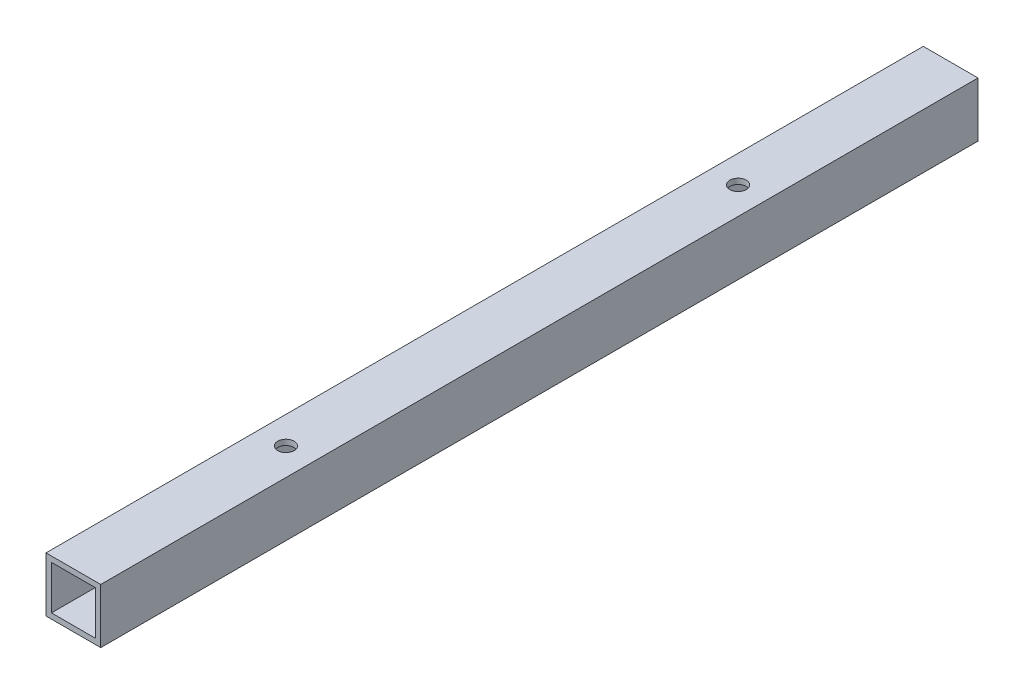
ISO-10303-21;
HEADER;
FILE_DESCRIPTION(('STEP AP214'),'2;1');
FILE_NAME('part.step','',(''),(''),'','','');
FILE_SCHEMA(('AUTOMOTIVE_DESIGN { 1 0 10303 214 1 1 1 1 }'));
ENDSEC;
DATA;
#1=APPLICATION_CONTEXT('core data for automotive mechanical design processes');
#2=APPLICATION_PROTOCOL_DEFINITION('international standard','automotive_design',2000,#1);
#3=PRODUCT_CONTEXT('',#1,'mechanical');
#4=PRODUCT('Part','Part','',(#3));
#5=PRODUCT_RELATED_PRODUCT_CATEGORY('part','',(#4));
#6=PRODUCT_DEFINITION_FORMATION('','',#4);
#7=PRODUCT_DEFINITION_CONTEXT('part definition',#1,'design');
#8=PRODUCT_DEFINITION('design','',#6,#7);
#9=PRODUCT_DEFINITION_SHAPE('','',#8);
#10=(LENGTH_UNIT() NAMED_UNIT(*) SI_UNIT(.MILLI.,.METRE.));
#11=(NAMED_UNIT(*) PLANE_ANGLE_UNIT() SI_UNIT($,.RADIAN.));
#12=(NAMED_UNIT(*) SI_UNIT($,.STERADIAN.) SOLID_ANGLE_UNIT());
#13=UNCERTAINTY_MEASURE_WITH_UNIT(LENGTH_MEASURE(1.E-05),#10,'distance_accuracy_value','');
#14=(GEOMETRIC_REPRESENTATION_CONTEXT(3) GLOBAL_UNCERTAINTY_ASSIGNED_CONTEXT((#13)) GLOBAL_UNIT_ASSIGNED_CONTEXT((#10,
#11,#12)) REPRESENTATION_CONTEXT('',''));
#15=CARTESIAN_POINT('',(0.,0.,0.));
#16=DIRECTION('',(0.,0.,1.));
#17=DIRECTION('',(1.,0.,0.));
#18=AXIS2_PLACEMENT_3D('',#15,#16,#17);
#19=CARTESIAN_POINT('',(0.,0.,80.155));
#20=DIRECTION('',(0.,0.,-1.));
#21=DIRECTION('',(-1.,0.,0.));
#22=AXIS2_PLACEMENT_3D('',#19,#20,#21);
#23=PLANE('',#22);
#24=DIRECTION('',(0.,-1.,0.));
#25=VECTOR('',#24,1.);
#26=CARTESIAN_POINT('',(-5.,5.,80.155));
#27=LINE('',#26,#25);
#28=CARTESIAN_POINT('',(-5.,5.,80.155));
#29=VERTEX_POINT('',#28);
#30=CARTESIAN_POINT('',(-5.,-5.,80.155));
#31=VERTEX_POINT('',#30);
#32=EDGE_CURVE('E140',#29,#31,#27,.T.);
#33=ORIENTED_EDGE('',*,*,#32,.T.);
#34=DIRECTION('',(1.,0.,0.));
#35=VECTOR('',#34,1.);
#36=CARTESIAN_POINT('',(5.,-5.,80.155));
#37=LINE('',#36,#35);
#38=CARTESIAN_POINT('',(5.,-5.,80.155));
#39=VERTEX_POINT('',#38);
#40=EDGE_CURVE('E143',#31,#39,#37,.T.);
#41=ORIENTED_EDGE('',*,*,#40,.T.);
#42=DIRECTION('',(0.,1.,0.));
#43=VECTOR('',#42,1.);
#44=CARTESIAN_POINT('',(5.,5.,80.155));
#45=LINE('',#44,#43);
#46=CARTESIAN_POINT('',(5.,5.,80.155));
#47=VERTEX_POINT('',#46);
#48=EDGE_CURVE('E146',#39,#47,#45,.T.);
#49=ORIENTED_EDGE('',*,*,#48,.T.);
#50=DIRECTION('',(-1.,0.,0.));
#51=VECTOR('',#50,1.);
#52=CARTESIAN_POINT('',(5.,5.,80.155));
#53=LINE('',#52,#51);
#54=EDGE_CURVE('E148',#47,#29,#53,.T.);
#55=ORIENTED_EDGE('',*,*,#54,.T.);
#56=EDGE_LOOP('',(#33,#41,#49,#55));
#57=FACE_BOUND('',#56,.T.);
#58=DIRECTION('',(0.,-1.,0.));
#59=VECTOR('',#58,1.);
#60=CARTESIAN_POINT('',(-4.,4.,80.155));
#61=LINE('',#60,#59);
#62=CARTESIAN_POINT('',(-4.,4.,80.155));
#63=VERTEX_POINT('',#62);
#64=CARTESIAN_POINT('',(-4.,-4.,80.155));
#65=VERTEX_POINT('',#64);
#66=EDGE_CURVE('E102',#63,#65,#61,.T.);
#67=ORIENTED_EDGE('',*,*,#66,.F.);
#68=DIRECTION('',(-1.,0.,0.));
#69=VECTOR('',#68,1.);
#70=CARTESIAN_POINT('',(3.99999999999999,4.,80.155));
#71=LINE('',#70,#69);
#72=CARTESIAN_POINT('',(3.99999999999999,4.,80.155));
#73=VERTEX_POINT('',#72);
#74=EDGE_CURVE('E124',#73,#63,#71,.T.);
#75=ORIENTED_EDGE('',*,*,#74,.F.);
#76=DIRECTION('',(0.,1.,0.));
#77=VECTOR('',#76,1.);
#78=CARTESIAN_POINT('',(3.99999999999999,4.,80.155));
#79=LINE('',#78,#77);
#80=CARTESIAN_POINT('',(3.99999999999999,-4.,80.155));
#81=VERTEX_POINT('',#80);
#82=EDGE_CURVE('E122',#81,#73,#79,.T.);
#83=ORIENTED_EDGE('',*,*,#82,.F.);
#84=DIRECTION('',(1.,0.,0.));
#85=VECTOR('',#84,1.);
#86=CARTESIAN_POINT('',(3.99999999999999,-4.,80.155));
#87=LINE('',#86,#85);
#88=EDGE_CURVE('E110',#65,#81,#87,.T.);
#89=ORIENTED_EDGE('',*,*,#88,.F.);
#90=EDGE_LOOP('',(#67,#75,#83,#89));
#91=FACE_BOUND('',#90,.T.);
#92=ADVANCED_FACE('F35',(#57,#91),#23,.F.);
#93=CARTESIAN_POINT('',(0.,0.,-80.155));
#94=DIRECTION('',(0.,0.,-1.));
#95=DIRECTION('',(-1.,0.,0.));
#96=AXIS2_PLACEMENT_3D('',#93,#94,#95);
#97=PLANE('',#96);
#98=DIRECTION('',(0.,-1.,0.));
#99=VECTOR('',#98,1.);
#100=CARTESIAN_POINT('',(-5.,5.,-80.155));
#101=LINE('',#100,#99);
#102=CARTESIAN_POINT('',(-5.,5.,-80.155));
#103=VERTEX_POINT('',#102);
#104=CARTESIAN_POINT('',(-5.,-5.,-80.155));
#105=VERTEX_POINT('',#104);
#106=EDGE_CURVE('E118',#103,#105,#101,.T.);
#107=ORIENTED_EDGE('',*,*,#106,.F.);
#108=DIRECTION('',(-1.,0.,0.));
#109=VECTOR('',#108,1.);
#110=CARTESIAN_POINT('',(5.,5.,-80.155));
#111=LINE('',#110,#109);
#112=CARTESIAN_POINT('',(5.,5.,-80.155));
#113=VERTEX_POINT('',#112);
#114=EDGE_CURVE('E144',#113,#103,#111,.T.);
#115=ORIENTED_EDGE('',*,*,#114,.F.);
#116=DIRECTION('',(0.,1.,0.));
#117=VECTOR('',#116,1.);
#118=CARTESIAN_POINT('',(5.,5.,-80.155));
#119=LINE('',#118,#117);
#120=CARTESIAN_POINT('',(5.,-5.,-80.155));
#121=VERTEX_POINT('',#120);
#122=EDGE_CURVE('E155',#121,#113,#119,.T.);
#123=ORIENTED_EDGE('',*,*,#122,.F.);
#124=DIRECTION('',(1.,0.,0.));
#125=VECTOR('',#124,1.);
#126=CARTESIAN_POINT('',(5.,-5.,-80.155));
#127=LINE('',#126,#125);
#128=EDGE_CURVE('E153',#105,#121,#127,.T.);
#129=ORIENTED_EDGE('',*,*,#128,.F.);
#130=EDGE_LOOP('',(#107,#115,#123,#129));
#131=FACE_BOUND('',#130,.T.);
#132=DIRECTION('',(-1.,0.,0.));
#133=VECTOR('',#132,1.);
#134=CARTESIAN_POINT('',(3.99999999999999,4.,-80.155));
#135=LINE('',#134,#133);
#136=CARTESIAN_POINT('',(3.99999999999999,4.,-80.155));
#137=VERTEX_POINT('',#136);
#138=CARTESIAN_POINT('',(-4.,4.,-80.155));
#139=VERTEX_POINT('',#138);
#140=EDGE_CURVE('E111',#137,#139,#135,.T.);
#141=ORIENTED_EDGE('',*,*,#140,.T.);
#142=DIRECTION('',(0.,-1.,0.));
#143=VECTOR('',#142,1.);
#144=CARTESIAN_POINT('',(-4.,4.,-80.155));
#145=LINE('',#144,#143);
#146=CARTESIAN_POINT('',(-4.,-4.,-80.155));
#147=VERTEX_POINT('',#146);
#148=EDGE_CURVE('E60',#139,#147,#145,.T.);
#149=ORIENTED_EDGE('',*,*,#148,.T.);
#150=DIRECTION('',(1.,0.,0.));
#151=VECTOR('',#150,1.);
#152=CARTESIAN_POINT('',(3.99999999999999,-4.,-80.155));
#153=LINE('',#152,#151);
#154=CARTESIAN_POINT('',(3.99999999999999,-4.,-80.155));
#155=VERTEX_POINT('',#154);
#156=EDGE_CURVE('E117',#147,#155,#153,.T.);
#157=ORIENTED_EDGE('',*,*,#156,.T.);
#158=DIRECTION('',(0.,1.,0.));
#159=VECTOR('',#158,1.);
#160=CARTESIAN_POINT('',(3.99999999999999,4.,-80.155));
#161=LINE('',#160,#159);
#162=EDGE_CURVE('E132',#155,#137,#161,.T.);
#163=ORIENTED_EDGE('',*,*,#162,.T.);
#164=EDGE_LOOP('',(#141,#149,#157,#163));
#165=FACE_BOUND('',#164,.T.);
#166=ADVANCED_FACE('F205',(#131,#165),#97,.T.);
#167=CARTESIAN_POINT('',(-5.,5.,80.155));
#168=DIRECTION('',(1.,0.,0.));
#169=DIRECTION('',(0.,0.,-1.));
#170=AXIS2_PLACEMENT_3D('',#167,#168,#169);
#171=PLANE('',#170);
#172=ORIENTED_EDGE('',*,*,#106,.T.);
#173=DIRECTION('',(0.,0.,-1.));
#174=VECTOR('',#173,1.);
#175=CARTESIAN_POINT('',(-5.,-5.,80.155));
#176=LINE('',#175,#174);
#177=EDGE_CURVE('E11',#31,#105,#176,.T.);
#178=ORIENTED_EDGE('',*,*,#177,.F.);
#179=ORIENTED_EDGE('',*,*,#32,.F.);
#180=DIRECTION('',(0.,0.,-1.));
#181=VECTOR('',#180,1.);
#182=CARTESIAN_POINT('',(-5.,5.,80.155));
#183=LINE('',#182,#181);
#184=EDGE_CURVE('E150',#29,#103,#183,.T.);
#185=ORIENTED_EDGE('',*,*,#184,.T.);
#186=EDGE_LOOP('',(#172,#178,#179,#185));
#187=FACE_BOUND('',#186,.T.);
#188=ADVANCED_FACE('F37',(#187),#171,.F.);
#189=CARTESIAN_POINT('',(5.,-5.,80.155));
#190=DIRECTION('',(0.,1.,0.));
#191=DIRECTION('',(-1.,0.,0.));
#192=AXIS2_PLACEMENT_3D('',#189,#190,#191);
#193=PLANE('',#192);
#194=CARTESIAN_POINT('',(-0.00347552228163782,-5.,41.3127409831395));
#195=DIRECTION('',(0.,-1.,0.));
#196=DIRECTION('',(0.,0.,-1.));
#197=AXIS2_PLACEMENT_3D('',#194,#195,#196);
#198=CIRCLE('',#197,1.50000000000001);
#199=CARTESIAN_POINT('',(-0.00347552228163782,-5.,39.8127409831395));
#200=VERTEX_POINT('',#199);
#201=EDGE_CURVE('E184',#200,#200,#198,.T.);
#202=ORIENTED_EDGE('',*,*,#201,.F.);
#203=EDGE_LOOP('',(#202));
#204=FACE_BOUND('',#203,.T.);
#205=CARTESIAN_POINT('',(-0.00347552228167946,-5.,-41.3127409831751));
#206=DIRECTION('',(0.,-1.,0.));
#207=DIRECTION('',(0.,0.,-1.));
#208=AXIS2_PLACEMENT_3D('',#205,#206,#207);
#209=CIRCLE('',#208,1.50000000000001);
#210=CARTESIAN_POINT('',(-0.00347552228167946,-5.,-42.8127409831752));
#211=VERTEX_POINT('',#210);
#212=EDGE_CURVE('E171',#211,#211,#209,.T.);
#213=ORIENTED_EDGE('',*,*,#212,.F.);
#214=EDGE_LOOP('',(#213));
#215=FACE_BOUND('',#214,.T.);
#216=ORIENTED_EDGE('',*,*,#128,.T.);
#217=DIRECTION('',(0.,0.,-1.));
#218=VECTOR('',#217,1.);
#219=CARTESIAN_POINT('',(5.,-5.,80.155));
#220=LINE('',#219,#218);
#221=EDGE_CURVE('E44',#39,#121,#220,.T.);
#222=ORIENTED_EDGE('',*,*,#221,.F.);
#223=ORIENTED_EDGE('',*,*,#40,.F.);
#224=ORIENTED_EDGE('',*,*,#177,.T.);
#225=EDGE_LOOP('',(#216,#222,#223,#224));
#226=FACE_BOUND('',#225,.T.);
#227=ADVANCED_FACE('F190',(#204,#215,#226),#193,.F.);
#228=CARTESIAN_POINT('',(5.,5.,80.155));
#229=DIRECTION('',(-1.,0.,0.));
#230=DIRECTION('',(0.,0.,1.));
#231=AXIS2_PLACEMENT_3D('',#228,#229,#230);
#232=PLANE('',#231);
#233=ORIENTED_EDGE('',*,*,#122,.T.);
#234=DIRECTION('',(0.,0.,-1.));
#235=VECTOR('',#234,1.);
#236=CARTESIAN_POINT('',(5.,5.,80.155));
#237=LINE('',#236,#235);
#238=EDGE_CURVE('E160',#47,#113,#237,.T.);
#239=ORIENTED_EDGE('',*,*,#238,.F.);
#240=ORIENTED_EDGE('',*,*,#48,.F.);
#241=ORIENTED_EDGE('',*,*,#221,.T.);
#242=EDGE_LOOP('',(#233,#239,#240,#241));
#243=FACE_BOUND('',#242,.T.);
#244=ADVANCED_FACE('F193',(#243),#232,.F.);
#245=CARTESIAN_POINT('',(5.,5.,80.155));
#246=DIRECTION('',(0.,-1.,0.));
#247=DIRECTION('',(0.,0.,-1.));
#248=AXIS2_PLACEMENT_3D('',#245,#246,#247);
#249=PLANE('',#248);
#250=CARTESIAN_POINT('',(-0.00347552228163782,4.99999999999999,41.3127409831395));
#251=DIRECTION('',(0.,-1.,0.));
#252=DIRECTION('',(0.,0.,-1.));
#253=AXIS2_PLACEMENT_3D('',#250,#251,#252);
#254=CIRCLE('',#253,1.50000000000001);
#255=CARTESIAN_POINT('',(-0.00347552228163782,4.99999999999999,39.8127409831395));
#256=VERTEX_POINT('',#255);
#257=EDGE_CURVE('E181',#256,#256,#254,.T.);
#258=ORIENTED_EDGE('',*,*,#257,.T.);
#259=EDGE_LOOP('',(#258));
#260=FACE_BOUND('',#259,.T.);
#261=CARTESIAN_POINT('',(-0.00347552228167946,4.99999999999999,-41.3127409831751));
#262=DIRECTION('',(0.,-1.,0.));
#263=DIRECTION('',(0.,0.,-1.));
#264=AXIS2_PLACEMENT_3D('',#261,#262,#263);
#265=CIRCLE('',#264,1.50000000000001);
#266=CARTESIAN_POINT('',(-0.00347552228167946,4.99999999999999,-42.8127409831752));
#267=VERTEX_POINT('',#266);
#268=EDGE_CURVE('E166',#267,#267,#265,.T.);
#269=ORIENTED_EDGE('',*,*,#268,.T.);
#270=EDGE_LOOP('',(#269));
#271=FACE_BOUND('',#270,.T.);
#272=ORIENTED_EDGE('',*,*,#114,.T.);
#273=ORIENTED_EDGE('',*,*,#184,.F.);
#274=ORIENTED_EDGE('',*,*,#54,.F.);
#275=ORIENTED_EDGE('',*,*,#238,.T.);
#276=EDGE_LOOP('',(#272,#273,#274,#275));
#277=FACE_BOUND('',#276,.T.);
#278=ADVANCED_FACE('F209',(#260,#271,#277),#249,.F.);
#279=CARTESIAN_POINT('',(-4.,4.,80.155));
#280=DIRECTION('',(1.,0.,0.));
#281=DIRECTION('',(0.,0.,-1.));
#282=AXIS2_PLACEMENT_3D('',#279,#280,#281);
#283=PLANE('',#282);
#284=ORIENTED_EDGE('',*,*,#148,.F.);
#285=DIRECTION('',(0.,0.,-1.));
#286=VECTOR('',#285,1.);
#287=CARTESIAN_POINT('',(-4.,4.,80.155));
#288=LINE('',#287,#286);
#289=EDGE_CURVE('E106',#63,#139,#288,.T.);
#290=ORIENTED_EDGE('',*,*,#289,.F.);
#291=ORIENTED_EDGE('',*,*,#66,.T.);
#292=DIRECTION('',(0.,0.,-1.));
#293=VECTOR('',#292,1.);
#294=CARTESIAN_POINT('',(-4.,-4.,80.155));
#295=LINE('',#294,#293);
#296=EDGE_CURVE('E105',#65,#147,#295,.T.);
#297=ORIENTED_EDGE('',*,*,#296,.T.);
#298=EDGE_LOOP('',(#284,#290,#291,#297));
#299=FACE_BOUND('',#298,.T.);
#300=ADVANCED_FACE('F104',(#299),#283,.T.);
#301=CARTESIAN_POINT('',(3.99999999999999,-4.,80.155));
#302=DIRECTION('',(0.,1.,0.));
#303=DIRECTION('',(0.,0.,1.));
#304=AXIS2_PLACEMENT_3D('',#301,#302,#303);
#305=PLANE('',#304);
#306=CARTESIAN_POINT('',(-0.00347552228163782,-4.,41.3127409831395));
#307=DIRECTION('',(0.,1.,0.));
#308=DIRECTION('',(0.,0.,1.));
#309=AXIS2_PLACEMENT_3D('',#306,#307,#308);
#310=CIRCLE('',#309,1.50000000000001);
#311=CARTESIAN_POINT('',(-0.00347552228163782,-4.,42.8127409831395));
#312=VERTEX_POINT('',#311);
#313=EDGE_CURVE('E176',#312,#312,#310,.T.);
#314=ORIENTED_EDGE('',*,*,#313,.F.);
#315=EDGE_LOOP('',(#314));
#316=FACE_BOUND('',#315,.T.);
#317=CARTESIAN_POINT('',(-0.00347552228167946,-4.,-41.3127409831751));
#318=DIRECTION('',(0.,1.,0.));
#319=DIRECTION('',(0.,0.,1.));
#320=AXIS2_PLACEMENT_3D('',#317,#318,#319);
#321=CIRCLE('',#320,1.50000000000001);
#322=CARTESIAN_POINT('',(-0.00347552228167946,-4.,-39.8127409831751));
#323=VERTEX_POINT('',#322);
#324=EDGE_CURVE('E130',#323,#323,#321,.T.);
#325=ORIENTED_EDGE('',*,*,#324,.F.);
#326=EDGE_LOOP('',(#325));
#327=FACE_BOUND('',#326,.T.);
#328=ORIENTED_EDGE('',*,*,#156,.F.);
#329=ORIENTED_EDGE('',*,*,#296,.F.);
#330=ORIENTED_EDGE('',*,*,#88,.T.);
#331=DIRECTION('',(0.,0.,-1.));
#332=VECTOR('',#331,1.);
#333=CARTESIAN_POINT('',(3.99999999999999,-4.,80.155));
#334=LINE('',#333,#332);
#335=EDGE_CURVE('E119',#81,#155,#334,.T.);
#336=ORIENTED_EDGE('',*,*,#335,.T.);
#337=EDGE_LOOP('',(#328,#329,#330,#336));
#338=FACE_BOUND('',#337,.T.);
#339=ADVANCED_FACE('F114',(#316,#327,#338),#305,.T.);
#340=CARTESIAN_POINT('',(3.99999999999999,4.,80.155));
#341=DIRECTION('',(-1.,0.,0.));
#342=DIRECTION('',(0.,0.,1.));
#343=AXIS2_PLACEMENT_3D('',#340,#341,#342);
#344=PLANE('',#343);
#345=ORIENTED_EDGE('',*,*,#162,.F.);
#346=ORIENTED_EDGE('',*,*,#335,.F.);
#347=ORIENTED_EDGE('',*,*,#82,.T.);
#348=DIRECTION('',(0.,0.,-1.));
#349=VECTOR('',#348,1.);
#350=CARTESIAN_POINT('',(3.99999999999999,4.,80.155));
#351=LINE('',#350,#349);
#352=EDGE_CURVE('E52',#73,#137,#351,.T.);
#353=ORIENTED_EDGE('',*,*,#352,.T.);
#354=EDGE_LOOP('',(#345,#346,#347,#353));
#355=FACE_BOUND('',#354,.T.);
#356=ADVANCED_FACE('F253',(#355),#344,.T.);
#357=CARTESIAN_POINT('',(3.99999999999999,4.,80.155));
#358=DIRECTION('',(0.,-1.,0.));
#359=DIRECTION('',(0.,0.,-1.));
#360=AXIS2_PLACEMENT_3D('',#357,#358,#359);
#361=PLANE('',#360);
#362=CARTESIAN_POINT('',(-0.00347552228163782,4.,41.3127409831395));
#363=DIRECTION('',(0.,-1.,0.));
#364=DIRECTION('',(0.,0.,-1.));
#365=AXIS2_PLACEMENT_3D('',#362,#363,#364);
#366=CIRCLE('',#365,1.50000000000001);
#367=CARTESIAN_POINT('',(-0.00347552228163782,4.,39.8127409831395));
#368=VERTEX_POINT('',#367);
#369=EDGE_CURVE('E39',#368,#368,#366,.T.);
#370=ORIENTED_EDGE('',*,*,#369,.F.);
#371=EDGE_LOOP('',(#370));
#372=FACE_BOUND('',#371,.T.);
#373=CARTESIAN_POINT('',(-0.00347552228167946,4.,-41.3127409831751));
#374=DIRECTION('',(0.,-1.,0.));
#375=DIRECTION('',(0.,0.,-1.));
#376=AXIS2_PLACEMENT_3D('',#373,#374,#375);
#377=CIRCLE('',#376,1.50000000000001);
#378=CARTESIAN_POINT('',(-0.00347552228167946,4.,-42.8127409831752));
#379=VERTEX_POINT('',#378);
#380=EDGE_CURVE('E164',#379,#379,#377,.T.);
#381=ORIENTED_EDGE('',*,*,#380,.F.);
#382=EDGE_LOOP('',(#381));
#383=FACE_BOUND('',#382,.T.);
#384=ORIENTED_EDGE('',*,*,#140,.F.);
#385=ORIENTED_EDGE('',*,*,#352,.F.);
#386=ORIENTED_EDGE('',*,*,#74,.T.);
#387=ORIENTED_EDGE('',*,*,#289,.T.);
#388=EDGE_LOOP('',(#384,#385,#386,#387));
#389=FACE_BOUND('',#388,.T.);
#390=ADVANCED_FACE('F262',(#372,#383,#389),#361,.T.);
#391=CARTESIAN_POINT('',(-0.00347552228167946,-5.,-41.3127409831751));
#392=DIRECTION('',(0.,-1.,0.));
#393=DIRECTION('',(0.,0.,-1.));
#394=AXIS2_PLACEMENT_3D('',#391,#392,#393);
#395=CYLINDRICAL_SURFACE('',#394,1.50000000000001);
#396=ORIENTED_EDGE('',*,*,#380,.T.);
#397=EDGE_LOOP('',(#396));
#398=FACE_BOUND('',#397,.T.);
#399=ORIENTED_EDGE('',*,*,#268,.F.);
#400=EDGE_LOOP('',(#399));
#401=FACE_BOUND('',#400,.T.);
#402=ADVANCED_FACE('F269',(#398,#401),#395,.F.);
#403=ORIENTED_EDGE('',*,*,#324,.T.);
#404=EDGE_LOOP('',(#403));
#405=FACE_BOUND('',#404,.T.);
#406=ORIENTED_EDGE('',*,*,#212,.T.);
#407=EDGE_LOOP('',(#406));
#408=FACE_BOUND('',#407,.T.);
#409=ADVANCED_FACE('F279',(#405,#408),#395,.F.);
#410=CARTESIAN_POINT('',(-0.00347552228163782,-5.,41.3127409831395));
#411=DIRECTION('',(0.,-1.,0.));
#412=DIRECTION('',(0.,0.,-1.));
#413=AXIS2_PLACEMENT_3D('',#410,#411,#412);
#414=CYLINDRICAL_SURFACE('',#413,1.50000000000001);
#415=ORIENTED_EDGE('',*,*,#369,.T.);
#416=EDGE_LOOP('',(#415));
#417=FACE_BOUND('',#416,.T.);
#418=ORIENTED_EDGE('',*,*,#257,.F.);
#419=EDGE_LOOP('',(#418));
#420=FACE_BOUND('',#419,.T.);
#421=ADVANCED_FACE('F285',(#417,#420),#414,.F.);
#422=ORIENTED_EDGE('',*,*,#313,.T.);
#423=EDGE_LOOP('',(#422));
#424=FACE_BOUND('',#423,.T.);
#425=ORIENTED_EDGE('',*,*,#201,.T.);
#426=EDGE_LOOP('',(#425));
#427=FACE_BOUND('',#426,.T.);
#428=ADVANCED_FACE('F188',(#424,#427),#414,.F.);
#429=CLOSED_SHELL('',(#92,#166,#188,#227,#244,#278,#300,#339,#356,#390,#402,#409,#421,#428));
#430=MANIFOLD_SOLID_BREP('B2',#429);
#431=ADVANCED_BREP_SHAPE_REPRESENTATION('',(#18,#430),#14);
#432=SHAPE_DEFINITION_REPRESENTATION(#9,#431);
ENDSEC;
END-ISO-10303-21;
